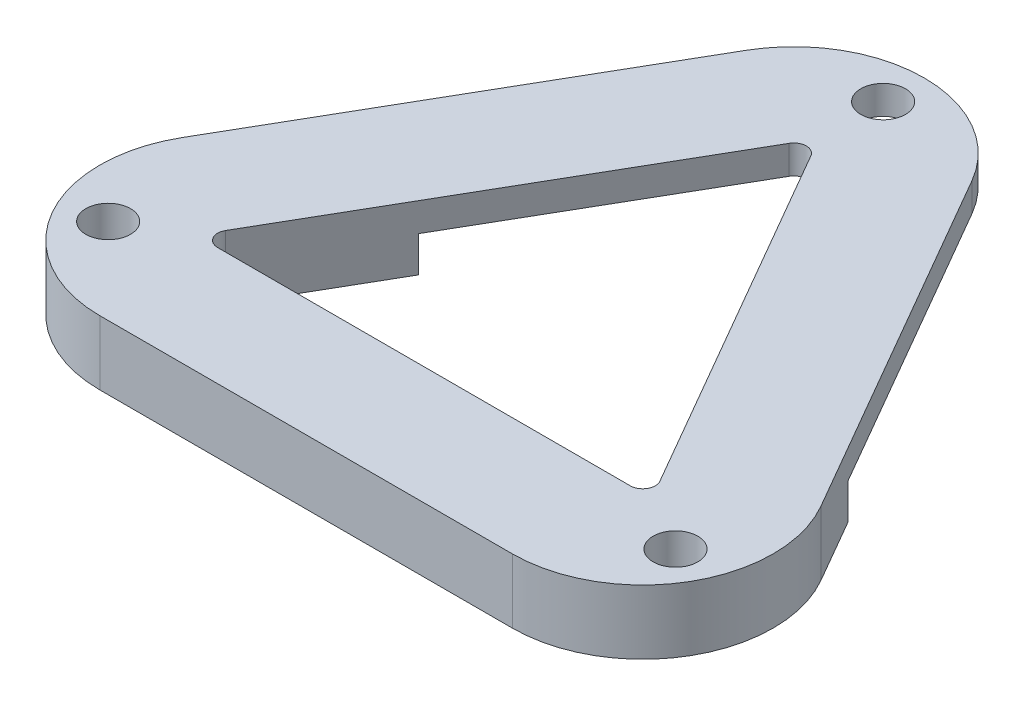
ISO-10303-21;
HEADER;
FILE_DESCRIPTION(('STEP AP214'),'2;1');
FILE_NAME('part.step','',(''),(''),'','','');
FILE_SCHEMA(('AUTOMOTIVE_DESIGN { 1 0 10303 214 1 1 1 1 }'));
ENDSEC;
DATA;
#1=APPLICATION_CONTEXT('core data for automotive mechanical design processes');
#2=APPLICATION_PROTOCOL_DEFINITION('international standard','automotive_design',2000,#1);
#3=PRODUCT_CONTEXT('',#1,'mechanical');
#4=PRODUCT('Part','Part','',(#3));
#5=PRODUCT_RELATED_PRODUCT_CATEGORY('part','',(#4));
#6=PRODUCT_DEFINITION_FORMATION('','',#4);
#7=PRODUCT_DEFINITION_CONTEXT('part definition',#1,'design');
#8=PRODUCT_DEFINITION('design','',#6,#7);
#9=PRODUCT_DEFINITION_SHAPE('','',#8);
#10=(LENGTH_UNIT() NAMED_UNIT(*) SI_UNIT(.MILLI.,.METRE.));
#11=(NAMED_UNIT(*) PLANE_ANGLE_UNIT() SI_UNIT($,.RADIAN.));
#12=(NAMED_UNIT(*) SI_UNIT($,.STERADIAN.) SOLID_ANGLE_UNIT());
#13=UNCERTAINTY_MEASURE_WITH_UNIT(LENGTH_MEASURE(1.E-05),#10,'distance_accuracy_value','');
#14=(GEOMETRIC_REPRESENTATION_CONTEXT(3) GLOBAL_UNCERTAINTY_ASSIGNED_CONTEXT((#13)) GLOBAL_UNIT_ASSIGNED_CONTEXT((#10,
#11,#12)) REPRESENTATION_CONTEXT('',''));
#15=CARTESIAN_POINT('',(0.,0.,0.));
#16=DIRECTION('',(0.,0.,1.));
#17=DIRECTION('',(1.,0.,0.));
#18=AXIS2_PLACEMENT_3D('',#15,#16,#17);
#19=CARTESIAN_POINT('',(0.,0.,-25.4));
#20=DIRECTION('',(0.,1.,0.));
#21=DIRECTION('',(0.,0.,1.));
#22=AXIS2_PLACEMENT_3D('',#19,#20,#21);
#23=PLANE('',#22);
#24=CARTESIAN_POINT('',(50.4098953786192,0.,46.0375));
#25=DIRECTION('',(0.,1.,0.));
#26=DIRECTION('',(0.,0.,1.));
#27=AXIS2_PLACEMENT_3D('',#24,#25,#26);
#28=CIRCLE('',#27,3.96874999999998);
#29=CARTESIAN_POINT('',(50.4098953786192,0.,50.00625));
#30=VERTEX_POINT('',#29);
#31=EDGE_CURVE('E315',#30,#30,#28,.T.);
#32=ORIENTED_EDGE('',*,*,#31,.T.);
#33=EDGE_LOOP('',(#32));
#34=FACE_BOUND('',#33,.T.);
#35=CARTESIAN_POINT('',(-50.4098953786192,0.,46.0375));
#36=DIRECTION('',(0.,1.,0.));
#37=DIRECTION('',(0.,0.,1.));
#38=AXIS2_PLACEMENT_3D('',#35,#36,#37);
#39=CIRCLE('',#38,3.96874999999998);
#40=CARTESIAN_POINT('',(-50.4098953786192,0.,50.00625));
#41=VERTEX_POINT('',#40);
#42=EDGE_CURVE('E307',#41,#41,#39,.T.);
#43=ORIENTED_EDGE('',*,*,#42,.T.);
#44=EDGE_LOOP('',(#43));
#45=FACE_BOUND('',#44,.T.);
#46=DIRECTION('',(1.,0.,0.));
#47=VECTOR('',#46,1.);
#48=CARTESIAN_POINT('',(-63.5,0.,15.24));
#49=LINE('',#48,#47);
#50=CARTESIAN_POINT('',(26.0298368864143,0.,15.24));
#51=VERTEX_POINT('',#50);
#52=CARTESIAN_POINT('',(50.2265866681515,0.,15.24));
#53=VERTEX_POINT('',#52);
#54=EDGE_CURVE('E206',#51,#53,#49,.T.);
#55=ORIENTED_EDGE('',*,*,#54,.T.);
#56=DIRECTION('',(-0.5,0.,-0.866025403784439));
#57=VECTOR('',#56,1.);
#58=CARTESIAN_POINT('',(56.7340458897551,0.,26.51125));
#59=LINE('',#58,#57);
#60=CARTESIAN_POINT('',(56.7340458897551,0.,26.51125));
#61=VERTEX_POINT('',#60);
#62=EDGE_CURVE('E243',#61,#53,#59,.T.);
#63=ORIENTED_EDGE('',*,*,#62,.F.);
#64=CARTESIAN_POINT('',(36.6617420935412,0.,38.1));
#65=DIRECTION('',(0.,1.,0.));
#66=DIRECTION('',(1.,0.,0.));
#67=AXIS2_PLACEMENT_3D('',#64,#65,#66);
#68=CIRCLE('',#67,23.1775);
#69=CARTESIAN_POINT('',(36.6617420935412,0.,61.2775));
#70=VERTEX_POINT('',#69);
#71=EDGE_CURVE('E240',#70,#61,#68,.T.);
#72=ORIENTED_EDGE('',*,*,#71,.F.);
#73=DIRECTION('',(1.,0.,0.));
#74=VECTOR('',#73,1.);
#75=CARTESIAN_POINT('',(-36.6617420935412,0.,61.2775));
#76=LINE('',#75,#74);
#77=CARTESIAN_POINT('',(-36.6617420935412,0.,61.2775));
#78=VERTEX_POINT('',#77);
#79=EDGE_CURVE('E229',#78,#70,#76,.T.);
#80=ORIENTED_EDGE('',*,*,#79,.F.);
#81=CARTESIAN_POINT('',(-36.6617420935412,0.,38.1));
#82=DIRECTION('',(0.,1.,0.));
#83=DIRECTION('',(1.,0.,0.));
#84=AXIS2_PLACEMENT_3D('',#81,#82,#83);
#85=CIRCLE('',#84,23.1775);
#86=CARTESIAN_POINT('',(-56.7340458897551,0.,26.51125));
#87=VERTEX_POINT('',#86);
#88=EDGE_CURVE('E223',#87,#78,#85,.T.);
#89=ORIENTED_EDGE('',*,*,#88,.F.);
#90=DIRECTION('',(-0.5,0.,0.866025403784439));
#91=VECTOR('',#90,1.);
#92=CARTESIAN_POINT('',(-20.0723037962138,0.,-36.98875));
#93=LINE('',#92,#91);
#94=CARTESIAN_POINT('',(-50.2265866681515,0.,15.24));
#95=VERTEX_POINT('',#94);
#96=EDGE_CURVE('E212',#95,#87,#93,.T.);
#97=ORIENTED_EDGE('',*,*,#96,.F.);
#98=CARTESIAN_POINT('',(-26.0298368864143,0.,15.24));
#99=VERTEX_POINT('',#98);
#100=EDGE_CURVE('E194',#95,#99,#49,.T.);
#101=ORIENTED_EDGE('',*,*,#100,.T.);
#102=DIRECTION('',(-0.5,0.,0.866025403784439));
#103=VECTOR('',#102,1.);
#104=CARTESIAN_POINT('',(-1.92474145991091,0.,-26.51125));
#105=LINE('',#104,#103);
#106=CARTESIAN_POINT('',(-38.5864835534521,0.,36.98875));
#107=VERTEX_POINT('',#106);
#108=EDGE_CURVE('E306',#99,#107,#105,.T.);
#109=ORIENTED_EDGE('',*,*,#108,.T.);
#110=CARTESIAN_POINT('',(-36.6617420935412,0.,38.1));
#111=DIRECTION('',(0.,1.,0.));
#112=DIRECTION('',(1.,0.,0.));
#113=AXIS2_PLACEMENT_3D('',#110,#111,#112);
#114=CIRCLE('',#113,2.2225);
#115=CARTESIAN_POINT('',(-36.6617420935412,0.,40.3225));
#116=VERTEX_POINT('',#115);
#117=EDGE_CURVE('E344',#107,#116,#114,.T.);
#118=ORIENTED_EDGE('',*,*,#117,.T.);
#119=DIRECTION('',(1.,0.,0.));
#120=VECTOR('',#119,1.);
#121=CARTESIAN_POINT('',(-36.6617420935412,0.,40.3225));
#122=LINE('',#121,#120);
#123=CARTESIAN_POINT('',(36.6617420935412,0.,40.3225));
#124=VERTEX_POINT('',#123);
#125=EDGE_CURVE('E348',#116,#124,#122,.T.);
#126=ORIENTED_EDGE('',*,*,#125,.T.);
#127=CARTESIAN_POINT('',(36.6617420935412,0.,38.1));
#128=DIRECTION('',(0.,1.,0.));
#129=DIRECTION('',(1.,0.,0.));
#130=AXIS2_PLACEMENT_3D('',#127,#128,#129);
#131=CIRCLE('',#130,2.22250000000001);
#132=CARTESIAN_POINT('',(38.5864835534522,0.,36.98875));
#133=VERTEX_POINT('',#132);
#134=EDGE_CURVE('E352',#124,#133,#131,.T.);
#135=ORIENTED_EDGE('',*,*,#134,.T.);
#136=DIRECTION('',(-0.5,0.,-0.866025403784439));
#137=VECTOR('',#136,1.);
#138=CARTESIAN_POINT('',(38.5864835534522,0.,36.98875));
#139=LINE('',#138,#137);
#140=EDGE_CURVE('E326',#133,#51,#139,.T.);
#141=ORIENTED_EDGE('',*,*,#140,.T.);
#142=EDGE_LOOP('',(#55,#63,#72,#80,#89,#97,#101,#109,#118,#126,#135,#141));
#143=FACE_BOUND('',#142,.T.);
#144=ADVANCED_FACE('F81',(#34,#45,#143),#23,.F.);
#145=CARTESIAN_POINT('',(-20.0723037962138,11.43,-36.98875));
#146=DIRECTION('',(0.866025403784439,0.,0.5));
#147=DIRECTION('',(0.5,0.,-0.866025403784439));
#148=AXIS2_PLACEMENT_3D('',#145,#146,#147);
#149=PLANE('',#148);
#150=DIRECTION('',(0.,1.,0.));
#151=VECTOR('',#150,1.);
#152=CARTESIAN_POINT('',(-50.2265866681515,11.43,15.24));
#153=LINE('',#152,#151);
#154=CARTESIAN_POINT('',(-50.2265866681515,6.35,15.24));
#155=VERTEX_POINT('',#154);
#156=EDGE_CURVE('E198',#95,#155,#153,.T.);
#157=ORIENTED_EDGE('',*,*,#156,.F.);
#158=ORIENTED_EDGE('',*,*,#96,.T.);
#159=DIRECTION('',(0.,-1.,0.));
#160=VECTOR('',#159,1.);
#161=CARTESIAN_POINT('',(-56.7340458897551,11.43,26.51125));
#162=LINE('',#161,#160);
#163=CARTESIAN_POINT('',(-56.7340458897551,11.43,26.51125));
#164=VERTEX_POINT('',#163);
#165=EDGE_CURVE('E264',#164,#87,#162,.T.);
#166=ORIENTED_EDGE('',*,*,#165,.F.);
#167=DIRECTION('',(-0.5,0.,0.866025403784439));
#168=VECTOR('',#167,1.);
#169=CARTESIAN_POINT('',(-20.0723037962138,11.43,-36.98875));
#170=LINE('',#169,#168);
#171=CARTESIAN_POINT('',(-20.0723037962138,11.43,-36.98875));
#172=VERTEX_POINT('',#171);
#173=EDGE_CURVE('E376',#172,#164,#170,.T.);
#174=ORIENTED_EDGE('',*,*,#173,.F.);
#175=DIRECTION('',(0.,-1.,0.));
#176=VECTOR('',#175,1.);
#177=CARTESIAN_POINT('',(-20.0723037962138,11.43,-36.98875));
#178=LINE('',#177,#176);
#179=CARTESIAN_POINT('',(-20.0723037962138,6.35,-36.98875));
#180=VERTEX_POINT('',#179);
#181=EDGE_CURVE('E90',#172,#180,#178,.T.);
#182=ORIENTED_EDGE('',*,*,#181,.T.);
#183=DIRECTION('',(-0.5,0.,0.866025403784439));
#184=VECTOR('',#183,1.);
#185=CARTESIAN_POINT('',(-20.0723037962138,6.35,-36.98875));
#186=LINE('',#185,#184);
#187=EDGE_CURVE('E215',#180,#155,#186,.T.);
#188=ORIENTED_EDGE('',*,*,#187,.T.);
#189=EDGE_LOOP('',(#157,#158,#166,#174,#182,#188));
#190=FACE_BOUND('',#189,.T.);
#191=ADVANCED_FACE('F210',(#190),#149,.F.);
#192=CARTESIAN_POINT('',(56.7340458897551,11.43,26.51125));
#193=DIRECTION('',(-0.866025403784439,0.,0.5));
#194=DIRECTION('',(0.5,0.,0.866025403784439));
#195=AXIS2_PLACEMENT_3D('',#192,#193,#194);
#196=PLANE('',#195);
#197=DIRECTION('',(0.,-1.,0.));
#198=VECTOR('',#197,1.);
#199=CARTESIAN_POINT('',(50.2265866681515,11.43,15.24));
#200=LINE('',#199,#198);
#201=CARTESIAN_POINT('',(50.2265866681515,6.35,15.24));
#202=VERTEX_POINT('',#201);
#203=EDGE_CURVE('E218',#202,#53,#200,.T.);
#204=ORIENTED_EDGE('',*,*,#203,.F.);
#205=DIRECTION('',(-0.5,0.,-0.866025403784439));
#206=VECTOR('',#205,1.);
#207=CARTESIAN_POINT('',(56.7340458897551,6.35,26.51125));
#208=LINE('',#207,#206);
#209=CARTESIAN_POINT('',(20.0723037962138,6.35,-36.98875));
#210=VERTEX_POINT('',#209);
#211=EDGE_CURVE('E288',#202,#210,#208,.T.);
#212=ORIENTED_EDGE('',*,*,#211,.T.);
#213=DIRECTION('',(0.,-1.,0.));
#214=VECTOR('',#213,1.);
#215=CARTESIAN_POINT('',(20.0723037962138,11.43,-36.98875));
#216=LINE('',#215,#214);
#217=CARTESIAN_POINT('',(20.0723037962138,11.43,-36.98875));
#218=VERTEX_POINT('',#217);
#219=EDGE_CURVE('E248',#218,#210,#216,.T.);
#220=ORIENTED_EDGE('',*,*,#219,.F.);
#221=DIRECTION('',(-0.5,0.,-0.866025403784439));
#222=VECTOR('',#221,1.);
#223=CARTESIAN_POINT('',(56.7340458897551,11.43,26.51125));
#224=LINE('',#223,#222);
#225=CARTESIAN_POINT('',(56.7340458897551,11.43,26.51125));
#226=VERTEX_POINT('',#225);
#227=EDGE_CURVE('E235',#226,#218,#224,.T.);
#228=ORIENTED_EDGE('',*,*,#227,.F.);
#229=DIRECTION('',(0.,-1.,0.));
#230=VECTOR('',#229,1.);
#231=CARTESIAN_POINT('',(56.7340458897551,11.43,26.51125));
#232=LINE('',#231,#230);
#233=EDGE_CURVE('E252',#226,#61,#232,.T.);
#234=ORIENTED_EDGE('',*,*,#233,.T.);
#235=ORIENTED_EDGE('',*,*,#62,.T.);
#236=EDGE_LOOP('',(#204,#212,#220,#228,#234,#235));
#237=FACE_BOUND('',#236,.T.);
#238=ADVANCED_FACE('F398',(#237),#196,.F.);
#239=CARTESIAN_POINT('',(-1.92474145991091,11.43,-26.51125));
#240=DIRECTION('',(0.866025403784439,0.,0.5));
#241=DIRECTION('',(0.5,0.,-0.866025403784439));
#242=AXIS2_PLACEMENT_3D('',#239,#240,#241);
#243=PLANE('',#242);
#244=ORIENTED_EDGE('',*,*,#108,.F.);
#245=DIRECTION('',(0.,1.,0.));
#246=VECTOR('',#245,1.);
#247=CARTESIAN_POINT('',(-26.0298368864143,11.43,15.24));
#248=LINE('',#247,#246);
#249=CARTESIAN_POINT('',(-26.0298368864143,6.35,15.24));
#250=VERTEX_POINT('',#249);
#251=EDGE_CURVE('E201',#99,#250,#248,.T.);
#252=ORIENTED_EDGE('',*,*,#251,.T.);
#253=DIRECTION('',(-0.5,0.,0.866025403784439));
#254=VECTOR('',#253,1.);
#255=CARTESIAN_POINT('',(-1.92474145991091,6.35,-26.51125));
#256=LINE('',#255,#254);
#257=CARTESIAN_POINT('',(-1.92474145991091,6.35,-26.51125));
#258=VERTEX_POINT('',#257);
#259=EDGE_CURVE('E285',#258,#250,#256,.T.);
#260=ORIENTED_EDGE('',*,*,#259,.F.);
#261=DIRECTION('',(0.,-1.,0.));
#262=VECTOR('',#261,1.);
#263=CARTESIAN_POINT('',(-1.92474145991091,11.43,-26.51125));
#264=LINE('',#263,#262);
#265=CARTESIAN_POINT('',(-1.92474145991091,11.43,-26.51125));
#266=VERTEX_POINT('',#265);
#267=EDGE_CURVE('E225',#266,#258,#264,.T.);
#268=ORIENTED_EDGE('',*,*,#267,.F.);
#269=DIRECTION('',(-0.5,0.,0.866025403784439));
#270=VECTOR('',#269,1.);
#271=CARTESIAN_POINT('',(-1.92474145991091,11.43,-26.51125));
#272=LINE('',#271,#270);
#273=CARTESIAN_POINT('',(-38.5864835534521,11.43,36.98875));
#274=VERTEX_POINT('',#273);
#275=EDGE_CURVE('E325',#266,#274,#272,.T.);
#276=ORIENTED_EDGE('',*,*,#275,.T.);
#277=DIRECTION('',(0.,-1.,0.));
#278=VECTOR('',#277,1.);
#279=CARTESIAN_POINT('',(-38.5864835534521,11.43,36.98875));
#280=LINE('',#279,#278);
#281=EDGE_CURVE('E232',#274,#107,#280,.T.);
#282=ORIENTED_EDGE('',*,*,#281,.T.);
#283=EDGE_LOOP('',(#244,#252,#260,#268,#276,#282));
#284=FACE_BOUND('',#283,.T.);
#285=ADVANCED_FACE('F426',(#284),#243,.T.);
#286=CARTESIAN_POINT('',(38.5864835534522,11.43,36.98875));
#287=DIRECTION('',(-0.866025403784439,0.,0.5));
#288=DIRECTION('',(0.5,0.,0.866025403784439));
#289=AXIS2_PLACEMENT_3D('',#286,#287,#288);
#290=PLANE('',#289);
#291=DIRECTION('',(-0.5,0.,-0.866025403784439));
#292=VECTOR('',#291,1.);
#293=CARTESIAN_POINT('',(38.5864835534522,6.35,36.98875));
#294=LINE('',#293,#292);
#295=CARTESIAN_POINT('',(26.0298368864143,6.35,15.24));
#296=VERTEX_POINT('',#295);
#297=CARTESIAN_POINT('',(1.92474145991092,6.35,-26.51125));
#298=VERTEX_POINT('',#297);
#299=EDGE_CURVE('E271',#296,#298,#294,.T.);
#300=ORIENTED_EDGE('',*,*,#299,.F.);
#301=DIRECTION('',(0.,-1.,0.));
#302=VECTOR('',#301,1.);
#303=CARTESIAN_POINT('',(26.0298368864143,11.43,15.24));
#304=LINE('',#303,#302);
#305=EDGE_CURVE('E12',#296,#51,#304,.T.);
#306=ORIENTED_EDGE('',*,*,#305,.T.);
#307=ORIENTED_EDGE('',*,*,#140,.F.);
#308=DIRECTION('',(0.,-1.,0.));
#309=VECTOR('',#308,1.);
#310=CARTESIAN_POINT('',(38.5864835534522,11.43,36.98875));
#311=LINE('',#310,#309);
#312=CARTESIAN_POINT('',(38.5864835534522,11.43,36.98875));
#313=VERTEX_POINT('',#312);
#314=EDGE_CURVE('E105',#313,#133,#311,.T.);
#315=ORIENTED_EDGE('',*,*,#314,.F.);
#316=DIRECTION('',(-0.5,0.,-0.866025403784439));
#317=VECTOR('',#316,1.);
#318=CARTESIAN_POINT('',(38.5864835534522,11.43,36.98875));
#319=LINE('',#318,#317);
#320=CARTESIAN_POINT('',(1.92474145991092,11.43,-26.51125));
#321=VERTEX_POINT('',#320);
#322=EDGE_CURVE('E338',#313,#321,#319,.T.);
#323=ORIENTED_EDGE('',*,*,#322,.T.);
#324=DIRECTION('',(0.,-1.,0.));
#325=VECTOR('',#324,1.);
#326=CARTESIAN_POINT('',(1.92474145991092,11.43,-26.51125));
#327=LINE('',#326,#325);
#328=EDGE_CURVE('E341',#321,#298,#327,.T.);
#329=ORIENTED_EDGE('',*,*,#328,.T.);
#330=EDGE_LOOP('',(#300,#306,#307,#315,#323,#329));
#331=FACE_BOUND('',#330,.T.);
#332=ADVANCED_FACE('F415',(#331),#290,.T.);
#333=CARTESIAN_POINT('',(0.,11.43,-25.4));
#334=DIRECTION('',(0.,1.,0.));
#335=DIRECTION('',(0.,0.,1.));
#336=AXIS2_PLACEMENT_3D('',#333,#334,#335);
#337=PLANE('',#336);
#338=CARTESIAN_POINT('',(-50.4098953786192,11.43,46.0375));
#339=DIRECTION('',(0.,1.,0.));
#340=DIRECTION('',(0.,0.,1.));
#341=AXIS2_PLACEMENT_3D('',#338,#339,#340);
#342=CIRCLE('',#341,3.96874999999998);
#343=CARTESIAN_POINT('',(-50.4098953786192,11.43,50.00625));
#344=VERTEX_POINT('',#343);
#345=EDGE_CURVE('E302',#344,#344,#342,.T.);
#346=ORIENTED_EDGE('',*,*,#345,.F.);
#347=EDGE_LOOP('',(#346));
#348=FACE_BOUND('',#347,.T.);
#349=CARTESIAN_POINT('',(0.,11.43,-41.275));
#350=DIRECTION('',(0.,1.,0.));
#351=DIRECTION('',(0.,0.,1.));
#352=AXIS2_PLACEMENT_3D('',#349,#350,#351);
#353=CIRCLE('',#352,3.96874999999999);
#354=CARTESIAN_POINT('',(0.,11.43,-37.30625));
#355=VERTEX_POINT('',#354);
#356=EDGE_CURVE('E311',#355,#355,#353,.T.);
#357=ORIENTED_EDGE('',*,*,#356,.F.);
#358=EDGE_LOOP('',(#357));
#359=FACE_BOUND('',#358,.T.);
#360=CARTESIAN_POINT('',(50.4098953786192,11.43,46.0375));
#361=DIRECTION('',(0.,1.,0.));
#362=DIRECTION('',(0.,0.,1.));
#363=AXIS2_PLACEMENT_3D('',#360,#361,#362);
#364=CIRCLE('',#363,3.96874999999998);
#365=CARTESIAN_POINT('',(50.4098953786192,11.43,50.00625));
#366=VERTEX_POINT('',#365);
#367=EDGE_CURVE('E217',#366,#366,#364,.T.);
#368=ORIENTED_EDGE('',*,*,#367,.F.);
#369=EDGE_LOOP('',(#368));
#370=FACE_BOUND('',#369,.T.);
#371=CARTESIAN_POINT('',(0.,11.43,-25.4));
#372=DIRECTION('',(0.,1.,0.));
#373=DIRECTION('',(1.,0.,0.));
#374=AXIS2_PLACEMENT_3D('',#371,#372,#373);
#375=CIRCLE('',#374,23.1775);
#376=EDGE_CURVE('E247',#218,#172,#375,.T.);
#377=ORIENTED_EDGE('',*,*,#376,.T.);
#378=ORIENTED_EDGE('',*,*,#173,.T.);
#379=CARTESIAN_POINT('',(-36.6617420935412,11.43,38.1));
#380=DIRECTION('',(0.,1.,0.));
#381=DIRECTION('',(1.,0.,0.));
#382=AXIS2_PLACEMENT_3D('',#379,#380,#381);
#383=CIRCLE('',#382,23.1775);
#384=CARTESIAN_POINT('',(-36.6617420935412,11.43,61.2775));
#385=VERTEX_POINT('',#384);
#386=EDGE_CURVE('E379',#164,#385,#383,.T.);
#387=ORIENTED_EDGE('',*,*,#386,.T.);
#388=DIRECTION('',(1.,0.,0.));
#389=VECTOR('',#388,1.);
#390=CARTESIAN_POINT('',(-36.6617420935412,11.43,61.2775));
#391=LINE('',#390,#389);
#392=CARTESIAN_POINT('',(36.6617420935412,11.43,61.2775));
#393=VERTEX_POINT('',#392);
#394=EDGE_CURVE('E382',#385,#393,#391,.T.);
#395=ORIENTED_EDGE('',*,*,#394,.T.);
#396=CARTESIAN_POINT('',(36.6617420935412,11.43,38.1));
#397=DIRECTION('',(0.,1.,0.));
#398=DIRECTION('',(1.,0.,0.));
#399=AXIS2_PLACEMENT_3D('',#396,#397,#398);
#400=CIRCLE('',#399,23.1775);
#401=EDGE_CURVE('E384',#393,#226,#400,.T.);
#402=ORIENTED_EDGE('',*,*,#401,.T.);
#403=ORIENTED_EDGE('',*,*,#227,.T.);
#404=EDGE_LOOP('',(#377,#378,#387,#395,#402,#403));
#405=FACE_BOUND('',#404,.T.);
#406=ORIENTED_EDGE('',*,*,#275,.F.);
#407=CARTESIAN_POINT('',(0.,11.43,-25.4));
#408=DIRECTION('',(0.,1.,0.));
#409=DIRECTION('',(1.,0.,0.));
#410=AXIS2_PLACEMENT_3D('',#407,#408,#409);
#411=CIRCLE('',#410,2.2225);
#412=EDGE_CURVE('E322',#321,#266,#411,.T.);
#413=ORIENTED_EDGE('',*,*,#412,.F.);
#414=ORIENTED_EDGE('',*,*,#322,.F.);
#415=CARTESIAN_POINT('',(36.6617420935412,11.43,38.1));
#416=DIRECTION('',(0.,1.,0.));
#417=DIRECTION('',(1.,0.,0.));
#418=AXIS2_PLACEMENT_3D('',#415,#416,#417);
#419=CIRCLE('',#418,2.22250000000001);
#420=CARTESIAN_POINT('',(36.6617420935412,11.43,40.3225));
#421=VERTEX_POINT('',#420);
#422=EDGE_CURVE('E335',#421,#313,#419,.T.);
#423=ORIENTED_EDGE('',*,*,#422,.F.);
#424=DIRECTION('',(1.,0.,0.));
#425=VECTOR('',#424,1.);
#426=CARTESIAN_POINT('',(-36.6617420935412,11.43,40.3225));
#427=LINE('',#426,#425);
#428=CARTESIAN_POINT('',(-36.6617420935412,11.43,40.3225));
#429=VERTEX_POINT('',#428);
#430=EDGE_CURVE('E332',#429,#421,#427,.T.);
#431=ORIENTED_EDGE('',*,*,#430,.F.);
#432=CARTESIAN_POINT('',(-36.6617420935412,11.43,38.1));
#433=DIRECTION('',(0.,1.,0.));
#434=DIRECTION('',(1.,0.,0.));
#435=AXIS2_PLACEMENT_3D('',#432,#433,#434);
#436=CIRCLE('',#435,2.2225);
#437=EDGE_CURVE('E329',#274,#429,#436,.T.);
#438=ORIENTED_EDGE('',*,*,#437,.F.);
#439=EDGE_LOOP('',(#406,#413,#414,#423,#431,#438));
#440=FACE_BOUND('',#439,.T.);
#441=ADVANCED_FACE('F392',(#348,#359,#370,#405,#440),#337,.T.);
#442=CARTESIAN_POINT('',(0.,11.43,-25.4));
#443=DIRECTION('',(0.,-1.,0.));
#444=DIRECTION('',(0.,0.,-1.));
#445=AXIS2_PLACEMENT_3D('',#442,#443,#444);
#446=CYLINDRICAL_SURFACE('',#445,23.1775);
#447=ORIENTED_EDGE('',*,*,#219,.T.);
#448=CARTESIAN_POINT('',(0.,6.35,-25.4));
#449=DIRECTION('',(0.,1.,0.));
#450=DIRECTION('',(0.,0.,1.));
#451=AXIS2_PLACEMENT_3D('',#448,#449,#450);
#452=CIRCLE('',#451,23.1775);
#453=EDGE_CURVE('E292',#210,#180,#452,.T.);
#454=ORIENTED_EDGE('',*,*,#453,.T.);
#455=ORIENTED_EDGE('',*,*,#181,.F.);
#456=ORIENTED_EDGE('',*,*,#376,.F.);
#457=EDGE_LOOP('',(#447,#454,#455,#456));
#458=FACE_BOUND('',#457,.T.);
#459=ADVANCED_FACE('F83',(#458),#446,.T.);
#460=CARTESIAN_POINT('',(-36.6617420935412,11.43,38.1));
#461=DIRECTION('',(0.,-1.,0.));
#462=DIRECTION('',(0.,0.,-1.));
#463=AXIS2_PLACEMENT_3D('',#460,#461,#462);
#464=CYLINDRICAL_SURFACE('',#463,23.1775);
#465=ORIENTED_EDGE('',*,*,#88,.T.);
#466=DIRECTION('',(0.,-1.,0.));
#467=VECTOR('',#466,1.);
#468=CARTESIAN_POINT('',(-36.6617420935412,11.43,61.2775));
#469=LINE('',#468,#467);
#470=EDGE_CURVE('E260',#385,#78,#469,.T.);
#471=ORIENTED_EDGE('',*,*,#470,.F.);
#472=ORIENTED_EDGE('',*,*,#386,.F.);
#473=ORIENTED_EDGE('',*,*,#165,.T.);
#474=EDGE_LOOP('',(#465,#471,#472,#473));
#475=FACE_BOUND('',#474,.T.);
#476=ADVANCED_FACE('F405',(#475),#464,.T.);
#477=CARTESIAN_POINT('',(-36.6617420935412,11.43,61.2775));
#478=DIRECTION('',(0.,0.,-1.));
#479=DIRECTION('',(-1.,0.,0.));
#480=AXIS2_PLACEMENT_3D('',#477,#478,#479);
#481=PLANE('',#480);
#482=ORIENTED_EDGE('',*,*,#79,.T.);
#483=DIRECTION('',(0.,-1.,0.));
#484=VECTOR('',#483,1.);
#485=CARTESIAN_POINT('',(36.6617420935412,11.43,61.2775));
#486=LINE('',#485,#484);
#487=EDGE_CURVE('E256',#393,#70,#486,.T.);
#488=ORIENTED_EDGE('',*,*,#487,.F.);
#489=ORIENTED_EDGE('',*,*,#394,.F.);
#490=ORIENTED_EDGE('',*,*,#470,.T.);
#491=EDGE_LOOP('',(#482,#488,#489,#490));
#492=FACE_BOUND('',#491,.T.);
#493=ADVANCED_FACE('F407',(#492),#481,.F.);
#494=CARTESIAN_POINT('',(36.6617420935412,11.43,38.1));
#495=DIRECTION('',(0.,-1.,0.));
#496=DIRECTION('',(0.,0.,-1.));
#497=AXIS2_PLACEMENT_3D('',#494,#495,#496);
#498=CYLINDRICAL_SURFACE('',#497,23.1775);
#499=ORIENTED_EDGE('',*,*,#71,.T.);
#500=ORIENTED_EDGE('',*,*,#233,.F.);
#501=ORIENTED_EDGE('',*,*,#401,.F.);
#502=ORIENTED_EDGE('',*,*,#487,.T.);
#503=EDGE_LOOP('',(#499,#500,#501,#502));
#504=FACE_BOUND('',#503,.T.);
#505=ADVANCED_FACE('F410',(#504),#498,.T.);
#506=CARTESIAN_POINT('',(0.,11.43,-25.4));
#507=DIRECTION('',(0.,-1.,0.));
#508=DIRECTION('',(0.,0.,-1.));
#509=AXIS2_PLACEMENT_3D('',#506,#507,#508);
#510=CYLINDRICAL_SURFACE('',#509,2.2225);
#511=CARTESIAN_POINT('',(0.,6.35,-25.4));
#512=DIRECTION('',(0.,1.,0.));
#513=DIRECTION('',(0.,0.,1.));
#514=AXIS2_PLACEMENT_3D('',#511,#512,#513);
#515=CIRCLE('',#514,2.2225);
#516=EDGE_CURVE('E277',#298,#258,#515,.T.);
#517=ORIENTED_EDGE('',*,*,#516,.F.);
#518=ORIENTED_EDGE('',*,*,#328,.F.);
#519=ORIENTED_EDGE('',*,*,#412,.T.);
#520=ORIENTED_EDGE('',*,*,#267,.T.);
#521=EDGE_LOOP('',(#517,#518,#519,#520));
#522=FACE_BOUND('',#521,.T.);
#523=ADVANCED_FACE('F421',(#522),#510,.F.);
#524=CARTESIAN_POINT('',(-36.6617420935412,11.43,38.1));
#525=DIRECTION('',(0.,-1.,0.));
#526=DIRECTION('',(0.,0.,-1.));
#527=AXIS2_PLACEMENT_3D('',#524,#525,#526);
#528=CYLINDRICAL_SURFACE('',#527,2.2225);
#529=ORIENTED_EDGE('',*,*,#117,.F.);
#530=ORIENTED_EDGE('',*,*,#281,.F.);
#531=ORIENTED_EDGE('',*,*,#437,.T.);
#532=DIRECTION('',(0.,-1.,0.));
#533=VECTOR('',#532,1.);
#534=CARTESIAN_POINT('',(-36.6617420935412,11.43,40.3225));
#535=LINE('',#534,#533);
#536=EDGE_CURVE('E367',#429,#116,#535,.T.);
#537=ORIENTED_EDGE('',*,*,#536,.T.);
#538=EDGE_LOOP('',(#529,#530,#531,#537));
#539=FACE_BOUND('',#538,.T.);
#540=ADVANCED_FACE('F435',(#539),#528,.F.);
#541=CARTESIAN_POINT('',(-36.6617420935412,11.43,40.3225));
#542=DIRECTION('',(0.,0.,-1.));
#543=DIRECTION('',(-1.,0.,0.));
#544=AXIS2_PLACEMENT_3D('',#541,#542,#543);
#545=PLANE('',#544);
#546=ORIENTED_EDGE('',*,*,#125,.F.);
#547=ORIENTED_EDGE('',*,*,#536,.F.);
#548=ORIENTED_EDGE('',*,*,#430,.T.);
#549=DIRECTION('',(0.,-1.,0.));
#550=VECTOR('',#549,1.);
#551=CARTESIAN_POINT('',(36.6617420935412,11.43,40.3225));
#552=LINE('',#551,#550);
#553=EDGE_CURVE('E364',#421,#124,#552,.T.);
#554=ORIENTED_EDGE('',*,*,#553,.T.);
#555=EDGE_LOOP('',(#546,#547,#548,#554));
#556=FACE_BOUND('',#555,.T.);
#557=ADVANCED_FACE('F438',(#556),#545,.T.);
#558=CARTESIAN_POINT('',(36.6617420935412,11.43,38.1));
#559=DIRECTION('',(0.,-1.,0.));
#560=DIRECTION('',(0.,0.,-1.));
#561=AXIS2_PLACEMENT_3D('',#558,#559,#560);
#562=CYLINDRICAL_SURFACE('',#561,2.22250000000001);
#563=ORIENTED_EDGE('',*,*,#134,.F.);
#564=ORIENTED_EDGE('',*,*,#553,.F.);
#565=ORIENTED_EDGE('',*,*,#422,.T.);
#566=ORIENTED_EDGE('',*,*,#314,.T.);
#567=EDGE_LOOP('',(#563,#564,#565,#566));
#568=FACE_BOUND('',#567,.T.);
#569=ADVANCED_FACE('F442',(#568),#562,.F.);
#570=CARTESIAN_POINT('',(50.4098953786192,11.43,46.0375));
#571=DIRECTION('',(0.,-1.,0.));
#572=DIRECTION('',(0.,0.,-1.));
#573=AXIS2_PLACEMENT_3D('',#570,#571,#572);
#574=CYLINDRICAL_SURFACE('',#573,3.96874999999998);
#575=ORIENTED_EDGE('',*,*,#367,.T.);
#576=EDGE_LOOP('',(#575));
#577=FACE_BOUND('',#576,.T.);
#578=ORIENTED_EDGE('',*,*,#31,.F.);
#579=EDGE_LOOP('',(#578));
#580=FACE_BOUND('',#579,.T.);
#581=ADVANCED_FACE('F444',(#577,#580),#574,.F.);
#582=CARTESIAN_POINT('',(0.,11.43,-41.275));
#583=DIRECTION('',(0.,-1.,0.));
#584=DIRECTION('',(0.,0.,-1.));
#585=AXIS2_PLACEMENT_3D('',#582,#583,#584);
#586=CYLINDRICAL_SURFACE('',#585,3.96874999999999);
#587=CARTESIAN_POINT('',(0.,6.35,-41.275));
#588=DIRECTION('',(0.,1.,0.));
#589=DIRECTION('',(0.,0.,1.));
#590=AXIS2_PLACEMENT_3D('',#587,#588,#589);
#591=CIRCLE('',#590,3.96874999999999);
#592=CARTESIAN_POINT('',(0.,6.35,-37.30625));
#593=VERTEX_POINT('',#592);
#594=EDGE_CURVE('E268',#593,#593,#591,.T.);
#595=ORIENTED_EDGE('',*,*,#594,.F.);
#596=EDGE_LOOP('',(#595));
#597=FACE_BOUND('',#596,.T.);
#598=ORIENTED_EDGE('',*,*,#356,.T.);
#599=EDGE_LOOP('',(#598));
#600=FACE_BOUND('',#599,.T.);
#601=ADVANCED_FACE('F451',(#597,#600),#586,.F.);
#602=CARTESIAN_POINT('',(-50.4098953786192,11.43,46.0375));
#603=DIRECTION('',(0.,-1.,0.));
#604=DIRECTION('',(0.,0.,-1.));
#605=AXIS2_PLACEMENT_3D('',#602,#603,#604);
#606=CYLINDRICAL_SURFACE('',#605,3.96874999999998);
#607=ORIENTED_EDGE('',*,*,#345,.T.);
#608=EDGE_LOOP('',(#607));
#609=FACE_BOUND('',#608,.T.);
#610=ORIENTED_EDGE('',*,*,#42,.F.);
#611=EDGE_LOOP('',(#610));
#612=FACE_BOUND('',#611,.T.);
#613=ADVANCED_FACE('F493',(#609,#612),#606,.F.);
#614=CARTESIAN_POINT('',(-63.5,6.35,15.24));
#615=DIRECTION('',(0.,0.,-1.));
#616=DIRECTION('',(-1.,0.,0.));
#617=AXIS2_PLACEMENT_3D('',#614,#615,#616);
#618=PLANE('',#617);
#619=ORIENTED_EDGE('',*,*,#156,.T.);
#620=DIRECTION('',(1.,0.,0.));
#621=VECTOR('',#620,1.);
#622=CARTESIAN_POINT('',(-63.5,6.35,15.24));
#623=LINE('',#622,#621);
#624=EDGE_CURVE('E272',#155,#250,#623,.T.);
#625=ORIENTED_EDGE('',*,*,#624,.T.);
#626=ORIENTED_EDGE('',*,*,#251,.F.);
#627=ORIENTED_EDGE('',*,*,#100,.F.);
#628=EDGE_LOOP('',(#619,#625,#626,#627));
#629=FACE_BOUND('',#628,.T.);
#630=ADVANCED_FACE('F196',(#629),#618,.T.);
#631=ORIENTED_EDGE('',*,*,#203,.T.);
#632=ORIENTED_EDGE('',*,*,#54,.F.);
#633=ORIENTED_EDGE('',*,*,#305,.F.);
#634=EDGE_CURVE('E97',#296,#202,#623,.T.);
#635=ORIENTED_EDGE('',*,*,#634,.T.);
#636=EDGE_LOOP('',(#631,#632,#633,#635));
#637=FACE_BOUND('',#636,.T.);
#638=ADVANCED_FACE('F413',(#637),#618,.T.);
#639=CARTESIAN_POINT('',(0.,6.35,0.));
#640=DIRECTION('',(0.,1.,0.));
#641=DIRECTION('',(0.,0.,1.));
#642=AXIS2_PLACEMENT_3D('',#639,#640,#641);
#643=PLANE('',#642);
#644=ORIENTED_EDGE('',*,*,#594,.T.);
#645=EDGE_LOOP('',(#644));
#646=FACE_BOUND('',#645,.T.);
#647=ORIENTED_EDGE('',*,*,#453,.F.);
#648=ORIENTED_EDGE('',*,*,#211,.F.);
#649=ORIENTED_EDGE('',*,*,#634,.F.);
#650=ORIENTED_EDGE('',*,*,#299,.T.);
#651=ORIENTED_EDGE('',*,*,#516,.T.);
#652=ORIENTED_EDGE('',*,*,#259,.T.);
#653=ORIENTED_EDGE('',*,*,#624,.F.);
#654=ORIENTED_EDGE('',*,*,#187,.F.);
#655=EDGE_LOOP('',(#647,#648,#649,#650,#651,#652,#653,#654));
#656=FACE_BOUND('',#655,.T.);
#657=ADVANCED_FACE('F418',(#646,#656),#643,.F.);
#658=CLOSED_SHELL('',(#144,#191,#238,#285,#332,#441,#459,#476,#493,#505,#523,#540,#557,#569,
#581,#601,#613,#630,#638,#657));
#659=MANIFOLD_SOLID_BREP('B2',#658);
#660=ADVANCED_BREP_SHAPE_REPRESENTATION('',(#18,#659),#14);
#661=SHAPE_DEFINITION_REPRESENTATION(#9,#660);
ENDSEC;
END-ISO-10303-21;
